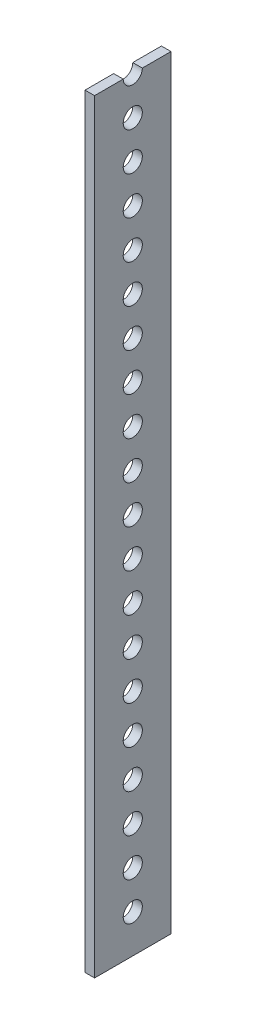
ISO-10303-21;
HEADER;
FILE_DESCRIPTION(('STEP AP214'),'2;1');
FILE_NAME('part.step','',(''),(''),'','','');
FILE_SCHEMA(('AUTOMOTIVE_DESIGN { 1 0 10303 214 1 1 1 1 }'));
ENDSEC;
DATA;
#1=APPLICATION_CONTEXT('core data for automotive mechanical design processes');
#2=APPLICATION_PROTOCOL_DEFINITION('international standard','automotive_design',2000,#1);
#3=PRODUCT_CONTEXT('',#1,'mechanical');
#4=PRODUCT('Part','Part','',(#3));
#5=PRODUCT_RELATED_PRODUCT_CATEGORY('part','',(#4));
#6=PRODUCT_DEFINITION_FORMATION('','',#4);
#7=PRODUCT_DEFINITION_CONTEXT('part definition',#1,'design');
#8=PRODUCT_DEFINITION('design','',#6,#7);
#9=PRODUCT_DEFINITION_SHAPE('','',#8);
#10=(LENGTH_UNIT() NAMED_UNIT(*) SI_UNIT(.MILLI.,.METRE.));
#11=(NAMED_UNIT(*) PLANE_ANGLE_UNIT() SI_UNIT($,.RADIAN.));
#12=(NAMED_UNIT(*) SI_UNIT($,.STERADIAN.) SOLID_ANGLE_UNIT());
#13=UNCERTAINTY_MEASURE_WITH_UNIT(LENGTH_MEASURE(1.E-05),#10,'distance_accuracy_value','');
#14=(GEOMETRIC_REPRESENTATION_CONTEXT(3) GLOBAL_UNCERTAINTY_ASSIGNED_CONTEXT((#13)) GLOBAL_UNIT_ASSIGNED_CONTEXT((#10,
#11,#12)) REPRESENTATION_CONTEXT('',''));
#15=CARTESIAN_POINT('',(0.,0.,0.));
#16=DIRECTION('',(0.,0.,1.));
#17=DIRECTION('',(1.,0.,0.));
#18=AXIS2_PLACEMENT_3D('',#15,#16,#17);
#19=CARTESIAN_POINT('',(3.175,0.,0.));
#20=DIRECTION('',(-1.,0.,0.));
#21=DIRECTION('',(0.,0.,1.));
#22=AXIS2_PLACEMENT_3D('',#19,#20,#21);
#23=PLANE('',#22);
#24=CARTESIAN_POINT('',(3.175,-685.8,0.));
#25=DIRECTION('',(1.,0.,0.));
#26=DIRECTION('',(0.,0.,-1.));
#27=AXIS2_PLACEMENT_3D('',#24,#25,#26);
#28=CIRCLE('',#27,3.175);
#29=CARTESIAN_POINT('',(3.175,-685.8,-3.175));
#30=VERTEX_POINT('',#29);
#31=EDGE_CURVE('E110',#30,#30,#28,.T.);
#32=ORIENTED_EDGE('',*,*,#31,.F.);
#33=EDGE_LOOP('',(#32));
#34=FACE_BOUND('',#33,.T.);
#35=CARTESIAN_POINT('',(3.175,-673.1,0.));
#36=DIRECTION('',(1.,0.,0.));
#37=DIRECTION('',(0.,0.,-1.));
#38=AXIS2_PLACEMENT_3D('',#35,#36,#37);
#39=CIRCLE('',#38,3.175);
#40=CARTESIAN_POINT('',(3.175,-673.1,-3.17499999999995));
#41=VERTEX_POINT('',#40);
#42=EDGE_CURVE('E239',#41,#41,#39,.T.);
#43=ORIENTED_EDGE('',*,*,#42,.F.);
#44=EDGE_LOOP('',(#43));
#45=FACE_BOUND('',#44,.T.);
#46=CARTESIAN_POINT('',(3.175,-660.4,0.));
#47=DIRECTION('',(1.,0.,0.));
#48=DIRECTION('',(0.,0.,-1.));
#49=AXIS2_PLACEMENT_3D('',#46,#47,#48);
#50=CIRCLE('',#49,3.175);
#51=CARTESIAN_POINT('',(3.175,-660.4,-3.17499999999991));
#52=VERTEX_POINT('',#51);
#53=EDGE_CURVE('E233',#52,#52,#50,.T.);
#54=ORIENTED_EDGE('',*,*,#53,.F.);
#55=EDGE_LOOP('',(#54));
#56=FACE_BOUND('',#55,.T.);
#57=CARTESIAN_POINT('',(3.175,-647.7,1.33025439009923E-13));
#58=DIRECTION('',(1.,0.,0.));
#59=DIRECTION('',(0.,0.,-1.));
#60=AXIS2_PLACEMENT_3D('',#57,#58,#59);
#61=CIRCLE('',#60,3.175);
#62=CARTESIAN_POINT('',(3.175,-647.7,-3.17499999999987));
#63=VERTEX_POINT('',#62);
#64=EDGE_CURVE('E227',#63,#63,#61,.T.);
#65=ORIENTED_EDGE('',*,*,#64,.F.);
#66=EDGE_LOOP('',(#65));
#67=FACE_BOUND('',#66,.T.);
#68=CARTESIAN_POINT('',(3.175,-635.,1.77367252013231E-13));
#69=DIRECTION('',(1.,0.,0.));
#70=DIRECTION('',(0.,0.,-1.));
#71=AXIS2_PLACEMENT_3D('',#68,#69,#70);
#72=CIRCLE('',#71,3.175);
#73=CARTESIAN_POINT('',(3.175,-635.,-3.17499999999982));
#74=VERTEX_POINT('',#73);
#75=EDGE_CURVE('E221',#74,#74,#72,.T.);
#76=ORIENTED_EDGE('',*,*,#75,.F.);
#77=EDGE_LOOP('',(#76));
#78=FACE_BOUND('',#77,.T.);
#79=CARTESIAN_POINT('',(3.175,-622.3,2.21709065016539E-13));
#80=DIRECTION('',(1.,0.,0.));
#81=DIRECTION('',(0.,0.,-1.));
#82=AXIS2_PLACEMENT_3D('',#79,#80,#81);
#83=CIRCLE('',#82,3.175);
#84=CARTESIAN_POINT('',(3.175,-622.3,-3.17499999999978));
#85=VERTEX_POINT('',#84);
#86=EDGE_CURVE('E215',#85,#85,#83,.T.);
#87=ORIENTED_EDGE('',*,*,#86,.F.);
#88=EDGE_LOOP('',(#87));
#89=FACE_BOUND('',#88,.T.);
#90=CARTESIAN_POINT('',(3.175,-609.6,2.66050878019847E-13));
#91=DIRECTION('',(1.,0.,0.));
#92=DIRECTION('',(0.,0.,-1.));
#93=AXIS2_PLACEMENT_3D('',#90,#91,#92);
#94=CIRCLE('',#93,3.17499999999997);
#95=CARTESIAN_POINT('',(3.175,-609.6,-3.1749999999997));
#96=VERTEX_POINT('',#95);
#97=EDGE_CURVE('E209',#96,#96,#94,.T.);
#98=ORIENTED_EDGE('',*,*,#97,.F.);
#99=EDGE_LOOP('',(#98));
#100=FACE_BOUND('',#99,.T.);
#101=CARTESIAN_POINT('',(3.175,-596.9,3.10392691023155E-13));
#102=DIRECTION('',(1.,0.,0.));
#103=DIRECTION('',(0.,0.,-1.));
#104=AXIS2_PLACEMENT_3D('',#101,#102,#103);
#105=CIRCLE('',#104,3.175);
#106=CARTESIAN_POINT('',(3.175,-596.9,-3.17499999999969));
#107=VERTEX_POINT('',#106);
#108=EDGE_CURVE('E203',#107,#107,#105,.T.);
#109=ORIENTED_EDGE('',*,*,#108,.F.);
#110=EDGE_LOOP('',(#109));
#111=FACE_BOUND('',#110,.T.);
#112=CARTESIAN_POINT('',(3.175,-584.2,3.54734504026462E-13));
#113=DIRECTION('',(1.,0.,0.));
#114=DIRECTION('',(0.,0.,-1.));
#115=AXIS2_PLACEMENT_3D('',#112,#113,#114);
#116=CIRCLE('',#115,3.175);
#117=CARTESIAN_POINT('',(3.175,-584.2,-3.17499999999964));
#118=VERTEX_POINT('',#117);
#119=EDGE_CURVE('E197',#118,#118,#116,.T.);
#120=ORIENTED_EDGE('',*,*,#119,.F.);
#121=EDGE_LOOP('',(#120));
#122=FACE_BOUND('',#121,.T.);
#123=CARTESIAN_POINT('',(3.175,-571.5,3.9907631702977E-13));
#124=DIRECTION('',(1.,0.,0.));
#125=DIRECTION('',(0.,0.,-1.));
#126=AXIS2_PLACEMENT_3D('',#123,#124,#125);
#127=CIRCLE('',#126,3.175);
#128=CARTESIAN_POINT('',(3.175,-571.5,-3.1749999999996));
#129=VERTEX_POINT('',#128);
#130=EDGE_CURVE('E191',#129,#129,#127,.T.);
#131=ORIENTED_EDGE('',*,*,#130,.F.);
#132=EDGE_LOOP('',(#131));
#133=FACE_BOUND('',#132,.T.);
#134=CARTESIAN_POINT('',(3.175,-558.8,4.43418130033078E-13));
#135=DIRECTION('',(1.,0.,0.));
#136=DIRECTION('',(0.,0.,-1.));
#137=AXIS2_PLACEMENT_3D('',#134,#135,#136);
#138=CIRCLE('',#137,3.175);
#139=CARTESIAN_POINT('',(3.175,-558.8,-3.17499999999956));
#140=VERTEX_POINT('',#139);
#141=EDGE_CURVE('E185',#140,#140,#138,.T.);
#142=ORIENTED_EDGE('',*,*,#141,.F.);
#143=EDGE_LOOP('',(#142));
#144=FACE_BOUND('',#143,.T.);
#145=CARTESIAN_POINT('',(3.175,-546.1,4.87759943036386E-13));
#146=DIRECTION('',(1.,0.,0.));
#147=DIRECTION('',(0.,0.,-1.));
#148=AXIS2_PLACEMENT_3D('',#145,#146,#147);
#149=CIRCLE('',#148,3.17500000000003);
#150=CARTESIAN_POINT('',(3.175,-546.1,-3.17499999999954));
#151=VERTEX_POINT('',#150);
#152=EDGE_CURVE('E179',#151,#151,#149,.T.);
#153=ORIENTED_EDGE('',*,*,#152,.F.);
#154=EDGE_LOOP('',(#153));
#155=FACE_BOUND('',#154,.T.);
#156=CARTESIAN_POINT('',(3.175,-533.4,5.32101756039693E-13));
#157=DIRECTION('',(1.,0.,0.));
#158=DIRECTION('',(0.,0.,-1.));
#159=AXIS2_PLACEMENT_3D('',#156,#157,#158);
#160=CIRCLE('',#159,3.175);
#161=CARTESIAN_POINT('',(3.175,-533.4,-3.17499999999947));
#162=VERTEX_POINT('',#161);
#163=EDGE_CURVE('E173',#162,#162,#160,.T.);
#164=ORIENTED_EDGE('',*,*,#163,.F.);
#165=EDGE_LOOP('',(#164));
#166=FACE_BOUND('',#165,.T.);
#167=CARTESIAN_POINT('',(3.175,-520.7,5.76443569043001E-13));
#168=DIRECTION('',(1.,0.,0.));
#169=DIRECTION('',(0.,0.,-1.));
#170=AXIS2_PLACEMENT_3D('',#167,#168,#169);
#171=CIRCLE('',#170,3.175);
#172=CARTESIAN_POINT('',(3.175,-520.7,-3.17499999999942));
#173=VERTEX_POINT('',#172);
#174=EDGE_CURVE('E167',#173,#173,#171,.T.);
#175=ORIENTED_EDGE('',*,*,#174,.F.);
#176=EDGE_LOOP('',(#175));
#177=FACE_BOUND('',#176,.T.);
#178=CARTESIAN_POINT('',(3.175,-508.,6.20785382046309E-13));
#179=DIRECTION('',(1.,0.,0.));
#180=DIRECTION('',(0.,0.,-1.));
#181=AXIS2_PLACEMENT_3D('',#178,#179,#180);
#182=CIRCLE('',#181,3.175);
#183=CARTESIAN_POINT('',(3.175,-508.,-3.17499999999938));
#184=VERTEX_POINT('',#183);
#185=EDGE_CURVE('E161',#184,#184,#182,.T.);
#186=ORIENTED_EDGE('',*,*,#185,.F.);
#187=EDGE_LOOP('',(#186));
#188=FACE_BOUND('',#187,.T.);
#189=CARTESIAN_POINT('',(3.175,-495.3,6.65127195049617E-13));
#190=DIRECTION('',(1.,0.,0.));
#191=DIRECTION('',(0.,0.,-1.));
#192=AXIS2_PLACEMENT_3D('',#189,#190,#191);
#193=CIRCLE('',#192,3.175);
#194=CARTESIAN_POINT('',(3.175,-495.3,-3.17499999999933));
#195=VERTEX_POINT('',#194);
#196=EDGE_CURVE('E155',#195,#195,#193,.T.);
#197=ORIENTED_EDGE('',*,*,#196,.F.);
#198=EDGE_LOOP('',(#197));
#199=FACE_BOUND('',#198,.T.);
#200=CARTESIAN_POINT('',(3.175,-482.6,7.09469008052925E-13));
#201=DIRECTION('',(1.,0.,0.));
#202=DIRECTION('',(0.,0.,-1.));
#203=AXIS2_PLACEMENT_3D('',#200,#201,#202);
#204=CIRCLE('',#203,3.175);
#205=CARTESIAN_POINT('',(3.175,-482.6,-3.17499999999929));
#206=VERTEX_POINT('',#205);
#207=EDGE_CURVE('E149',#206,#206,#204,.T.);
#208=ORIENTED_EDGE('',*,*,#207,.F.);
#209=EDGE_LOOP('',(#208));
#210=FACE_BOUND('',#209,.T.);
#211=CARTESIAN_POINT('',(3.175,-469.9,7.53810821056232E-13));
#212=DIRECTION('',(1.,0.,0.));
#213=DIRECTION('',(0.,0.,-1.));
#214=AXIS2_PLACEMENT_3D('',#211,#212,#213);
#215=CIRCLE('',#214,3.175);
#216=CARTESIAN_POINT('',(3.175,-469.9,-3.17499999999925));
#217=VERTEX_POINT('',#216);
#218=EDGE_CURVE('E143',#217,#217,#215,.T.);
#219=ORIENTED_EDGE('',*,*,#218,.F.);
#220=EDGE_LOOP('',(#219));
#221=FACE_BOUND('',#220,.T.);
#222=CARTESIAN_POINT('',(3.175,-457.2,7.9815263405954E-13));
#223=DIRECTION('',(1.,0.,0.));
#224=DIRECTION('',(0.,0.,-1.));
#225=AXIS2_PLACEMENT_3D('',#222,#223,#224);
#226=CIRCLE('',#225,3.175);
#227=CARTESIAN_POINT('',(3.175,-457.2,-3.1749999999992));
#228=VERTEX_POINT('',#227);
#229=EDGE_CURVE('E136',#228,#228,#226,.T.);
#230=ORIENTED_EDGE('',*,*,#229,.F.);
#231=EDGE_LOOP('',(#230));
#232=FACE_BOUND('',#231,.T.);
#233=DIRECTION('',(0.,1.,0.));
#234=VECTOR('',#233,1.);
#235=CARTESIAN_POINT('',(3.175,-698.500000000006,-12.7));
#236=LINE('',#235,#234);
#237=CARTESIAN_POINT('',(3.175,-698.500000000006,-12.7));
#238=VERTEX_POINT('',#237);
#239=CARTESIAN_POINT('',(3.175,-444.500000000006,-12.7));
#240=VERTEX_POINT('',#239);
#241=EDGE_CURVE('E107',#238,#240,#236,.T.);
#242=ORIENTED_EDGE('',*,*,#241,.T.);
#243=DIRECTION('',(0.,0.,1.));
#244=VECTOR('',#243,1.);
#245=CARTESIAN_POINT('',(3.175,-444.500000000006,0.));
#246=LINE('',#245,#244);
#247=CARTESIAN_POINT('',(3.175,-444.500000000006,-3.17499999999916));
#248=VERTEX_POINT('',#247);
#249=EDGE_CURVE('E121',#240,#248,#246,.T.);
#250=ORIENTED_EDGE('',*,*,#249,.T.);
#251=CARTESIAN_POINT('',(3.175,-444.5,8.42494447062848E-13));
#252=DIRECTION('',(1.,0.,0.));
#253=DIRECTION('',(0.,0.,-1.));
#254=AXIS2_PLACEMENT_3D('',#251,#252,#253);
#255=CIRCLE('',#254,3.175);
#256=CARTESIAN_POINT('',(3.175,-444.500000000006,3.17500000000084));
#257=VERTEX_POINT('',#256);
#258=EDGE_CURVE('E128',#257,#248,#255,.T.);
#259=ORIENTED_EDGE('',*,*,#258,.F.);
#260=CARTESIAN_POINT('',(3.175,-444.500000000006,12.6999999999999));
#261=VERTEX_POINT('',#260);
#262=EDGE_CURVE('E54',#257,#261,#246,.T.);
#263=ORIENTED_EDGE('',*,*,#262,.T.);
#264=DIRECTION('',(0.,-1.,0.));
#265=VECTOR('',#264,1.);
#266=CARTESIAN_POINT('',(3.175,-698.500000000006,12.7));
#267=LINE('',#266,#265);
#268=CARTESIAN_POINT('',(3.175,-698.500000000006,12.7));
#269=VERTEX_POINT('',#268);
#270=EDGE_CURVE('E97',#261,#269,#267,.T.);
#271=ORIENTED_EDGE('',*,*,#270,.T.);
#272=DIRECTION('',(0.,0.,-1.));
#273=VECTOR('',#272,1.);
#274=CARTESIAN_POINT('',(3.175,-698.500000000006,12.7));
#275=LINE('',#274,#273);
#276=EDGE_CURVE('E118',#269,#238,#275,.T.);
#277=ORIENTED_EDGE('',*,*,#276,.T.);
#278=EDGE_LOOP('',(#242,#250,#259,#263,#271,#277));
#279=FACE_BOUND('',#278,.T.);
#280=ADVANCED_FACE('F32',(#34,#45,#56,#67,#78,#89,#100,#111,#122,#133,#144,#155,#166,#177,#188,
#199,#210,#221,#232,#279),#23,.F.);
#281=CARTESIAN_POINT('',(0.,0.,0.));
#282=DIRECTION('',(-1.,0.,0.));
#283=DIRECTION('',(0.,0.,1.));
#284=AXIS2_PLACEMENT_3D('',#281,#282,#283);
#285=PLANE('',#284);
#286=DIRECTION('',(0.,0.,-1.));
#287=VECTOR('',#286,1.);
#288=CARTESIAN_POINT('',(0.,-444.500000000006,12.6999999999999));
#289=LINE('',#288,#287);
#290=CARTESIAN_POINT('',(0.,-444.500000000006,-3.17499999999916));
#291=VERTEX_POINT('',#290);
#292=CARTESIAN_POINT('',(0.,-444.500000000006,-12.7));
#293=VERTEX_POINT('',#292);
#294=EDGE_CURVE('E47',#291,#293,#289,.T.);
#295=ORIENTED_EDGE('',*,*,#294,.T.);
#296=DIRECTION('',(0.,1.,0.));
#297=VECTOR('',#296,1.);
#298=CARTESIAN_POINT('',(0.,-698.500000000006,-12.7));
#299=LINE('',#298,#297);
#300=CARTESIAN_POINT('',(0.,-698.500000000006,-12.7));
#301=VERTEX_POINT('',#300);
#302=EDGE_CURVE('E105',#301,#293,#299,.T.);
#303=ORIENTED_EDGE('',*,*,#302,.F.);
#304=DIRECTION('',(0.,0.,-1.));
#305=VECTOR('',#304,1.);
#306=CARTESIAN_POINT('',(0.,-698.500000000006,12.7));
#307=LINE('',#306,#305);
#308=CARTESIAN_POINT('',(0.,-698.500000000006,12.7));
#309=VERTEX_POINT('',#308);
#310=EDGE_CURVE('E104',#309,#301,#307,.T.);
#311=ORIENTED_EDGE('',*,*,#310,.F.);
#312=DIRECTION('',(0.,-1.,0.));
#313=VECTOR('',#312,1.);
#314=CARTESIAN_POINT('',(0.,-698.500000000006,12.7));
#315=LINE('',#314,#313);
#316=CARTESIAN_POINT('',(0.,-444.500000000006,12.6999999999999));
#317=VERTEX_POINT('',#316);
#318=EDGE_CURVE('E95',#317,#309,#315,.T.);
#319=ORIENTED_EDGE('',*,*,#318,.F.);
#320=CARTESIAN_POINT('',(0.,-444.500000000006,3.17500000000084));
#321=VERTEX_POINT('',#320);
#322=EDGE_CURVE('E82',#317,#321,#289,.T.);
#323=ORIENTED_EDGE('',*,*,#322,.T.);
#324=CARTESIAN_POINT('',(0.,-444.5,8.42494447062848E-13));
#325=DIRECTION('',(1.,0.,0.));
#326=DIRECTION('',(0.,0.,-1.));
#327=AXIS2_PLACEMENT_3D('',#324,#325,#326);
#328=CIRCLE('',#327,3.175);
#329=EDGE_CURVE('E133',#321,#291,#328,.T.);
#330=ORIENTED_EDGE('',*,*,#329,.T.);
#331=EDGE_LOOP('',(#295,#303,#311,#319,#323,#330));
#332=FACE_BOUND('',#331,.T.);
#333=CARTESIAN_POINT('',(0.,-469.9,7.53810821056232E-13));
#334=DIRECTION('',(1.,0.,0.));
#335=DIRECTION('',(0.,0.,-1.));
#336=AXIS2_PLACEMENT_3D('',#333,#334,#335);
#337=CIRCLE('',#336,3.175);
#338=CARTESIAN_POINT('',(0.,-469.9,-3.17499999999925));
#339=VERTEX_POINT('',#338);
#340=EDGE_CURVE('E141',#339,#339,#337,.T.);
#341=ORIENTED_EDGE('',*,*,#340,.T.);
#342=EDGE_LOOP('',(#341));
#343=FACE_BOUND('',#342,.T.);
#344=CARTESIAN_POINT('',(0.,-495.3,6.65127195049617E-13));
#345=DIRECTION('',(1.,0.,0.));
#346=DIRECTION('',(0.,0.,-1.));
#347=AXIS2_PLACEMENT_3D('',#344,#345,#346);
#348=CIRCLE('',#347,3.175);
#349=CARTESIAN_POINT('',(0.,-495.3,-3.17499999999933));
#350=VERTEX_POINT('',#349);
#351=EDGE_CURVE('E152',#350,#350,#348,.T.);
#352=ORIENTED_EDGE('',*,*,#351,.T.);
#353=EDGE_LOOP('',(#352));
#354=FACE_BOUND('',#353,.T.);
#355=CARTESIAN_POINT('',(0.,-520.7,5.76443569043001E-13));
#356=DIRECTION('',(1.,0.,0.));
#357=DIRECTION('',(0.,0.,-1.));
#358=AXIS2_PLACEMENT_3D('',#355,#356,#357);
#359=CIRCLE('',#358,3.175);
#360=CARTESIAN_POINT('',(0.,-520.7,-3.17499999999942));
#361=VERTEX_POINT('',#360);
#362=EDGE_CURVE('E164',#361,#361,#359,.T.);
#363=ORIENTED_EDGE('',*,*,#362,.T.);
#364=EDGE_LOOP('',(#363));
#365=FACE_BOUND('',#364,.T.);
#366=CARTESIAN_POINT('',(0.,-546.1,4.87759943036386E-13));
#367=DIRECTION('',(1.,0.,0.));
#368=DIRECTION('',(0.,0.,-1.));
#369=AXIS2_PLACEMENT_3D('',#366,#367,#368);
#370=CIRCLE('',#369,3.17500000000003);
#371=CARTESIAN_POINT('',(0.,-546.1,-3.17499999999954));
#372=VERTEX_POINT('',#371);
#373=EDGE_CURVE('E176',#372,#372,#370,.T.);
#374=ORIENTED_EDGE('',*,*,#373,.T.);
#375=EDGE_LOOP('',(#374));
#376=FACE_BOUND('',#375,.T.);
#377=CARTESIAN_POINT('',(0.,-571.5,3.9907631702977E-13));
#378=DIRECTION('',(1.,0.,0.));
#379=DIRECTION('',(0.,0.,-1.));
#380=AXIS2_PLACEMENT_3D('',#377,#378,#379);
#381=CIRCLE('',#380,3.175);
#382=CARTESIAN_POINT('',(0.,-571.5,-3.1749999999996));
#383=VERTEX_POINT('',#382);
#384=EDGE_CURVE('E188',#383,#383,#381,.T.);
#385=ORIENTED_EDGE('',*,*,#384,.T.);
#386=EDGE_LOOP('',(#385));
#387=FACE_BOUND('',#386,.T.);
#388=CARTESIAN_POINT('',(0.,-596.9,3.10392691023155E-13));
#389=DIRECTION('',(1.,0.,0.));
#390=DIRECTION('',(0.,0.,-1.));
#391=AXIS2_PLACEMENT_3D('',#388,#389,#390);
#392=CIRCLE('',#391,3.175);
#393=CARTESIAN_POINT('',(0.,-596.9,-3.17499999999969));
#394=VERTEX_POINT('',#393);
#395=EDGE_CURVE('E200',#394,#394,#392,.T.);
#396=ORIENTED_EDGE('',*,*,#395,.T.);
#397=EDGE_LOOP('',(#396));
#398=FACE_BOUND('',#397,.T.);
#399=CARTESIAN_POINT('',(0.,-622.3,2.21709065016539E-13));
#400=DIRECTION('',(1.,0.,0.));
#401=DIRECTION('',(0.,0.,-1.));
#402=AXIS2_PLACEMENT_3D('',#399,#400,#401);
#403=CIRCLE('',#402,3.175);
#404=CARTESIAN_POINT('',(0.,-622.3,-3.17499999999978));
#405=VERTEX_POINT('',#404);
#406=EDGE_CURVE('E212',#405,#405,#403,.T.);
#407=ORIENTED_EDGE('',*,*,#406,.T.);
#408=EDGE_LOOP('',(#407));
#409=FACE_BOUND('',#408,.T.);
#410=CARTESIAN_POINT('',(0.,-647.7,1.33025439009923E-13));
#411=DIRECTION('',(1.,0.,0.));
#412=DIRECTION('',(0.,0.,-1.));
#413=AXIS2_PLACEMENT_3D('',#410,#411,#412);
#414=CIRCLE('',#413,3.175);
#415=CARTESIAN_POINT('',(0.,-647.7,-3.17499999999987));
#416=VERTEX_POINT('',#415);
#417=EDGE_CURVE('E224',#416,#416,#414,.T.);
#418=ORIENTED_EDGE('',*,*,#417,.T.);
#419=EDGE_LOOP('',(#418));
#420=FACE_BOUND('',#419,.T.);
#421=CARTESIAN_POINT('',(0.,-673.1,0.));
#422=DIRECTION('',(1.,0.,0.));
#423=DIRECTION('',(0.,0.,-1.));
#424=AXIS2_PLACEMENT_3D('',#421,#422,#423);
#425=CIRCLE('',#424,3.175);
#426=CARTESIAN_POINT('',(0.,-673.1,-3.17499999999995));
#427=VERTEX_POINT('',#426);
#428=EDGE_CURVE('E236',#427,#427,#425,.T.);
#429=ORIENTED_EDGE('',*,*,#428,.T.);
#430=EDGE_LOOP('',(#429));
#431=FACE_BOUND('',#430,.T.);
#432=CARTESIAN_POINT('',(0.,-685.8,0.));
#433=DIRECTION('',(1.,0.,0.));
#434=DIRECTION('',(0.,0.,-1.));
#435=AXIS2_PLACEMENT_3D('',#432,#433,#434);
#436=CIRCLE('',#435,3.175);
#437=CARTESIAN_POINT('',(0.,-685.8,-3.175));
#438=VERTEX_POINT('',#437);
#439=EDGE_CURVE('E242',#438,#438,#436,.T.);
#440=ORIENTED_EDGE('',*,*,#439,.T.);
#441=EDGE_LOOP('',(#440));
#442=FACE_BOUND('',#441,.T.);
#443=CARTESIAN_POINT('',(0.,-660.4,0.));
#444=DIRECTION('',(1.,0.,0.));
#445=DIRECTION('',(0.,0.,-1.));
#446=AXIS2_PLACEMENT_3D('',#443,#444,#445);
#447=CIRCLE('',#446,3.175);
#448=CARTESIAN_POINT('',(0.,-660.4,-3.17499999999991));
#449=VERTEX_POINT('',#448);
#450=EDGE_CURVE('E230',#449,#449,#447,.T.);
#451=ORIENTED_EDGE('',*,*,#450,.T.);
#452=EDGE_LOOP('',(#451));
#453=FACE_BOUND('',#452,.T.);
#454=CARTESIAN_POINT('',(0.,-635.,1.77367252013231E-13));
#455=DIRECTION('',(1.,0.,0.));
#456=DIRECTION('',(0.,0.,-1.));
#457=AXIS2_PLACEMENT_3D('',#454,#455,#456);
#458=CIRCLE('',#457,3.175);
#459=CARTESIAN_POINT('',(0.,-635.,-3.17499999999982));
#460=VERTEX_POINT('',#459);
#461=EDGE_CURVE('E218',#460,#460,#458,.T.);
#462=ORIENTED_EDGE('',*,*,#461,.T.);
#463=EDGE_LOOP('',(#462));
#464=FACE_BOUND('',#463,.T.);
#465=CARTESIAN_POINT('',(0.,-609.6,2.66050878019847E-13));
#466=DIRECTION('',(1.,0.,0.));
#467=DIRECTION('',(0.,0.,-1.));
#468=AXIS2_PLACEMENT_3D('',#465,#466,#467);
#469=CIRCLE('',#468,3.17499999999997);
#470=CARTESIAN_POINT('',(0.,-609.6,-3.1749999999997));
#471=VERTEX_POINT('',#470);
#472=EDGE_CURVE('E206',#471,#471,#469,.T.);
#473=ORIENTED_EDGE('',*,*,#472,.T.);
#474=EDGE_LOOP('',(#473));
#475=FACE_BOUND('',#474,.T.);
#476=CARTESIAN_POINT('',(0.,-584.2,3.54734504026462E-13));
#477=DIRECTION('',(1.,0.,0.));
#478=DIRECTION('',(0.,0.,-1.));
#479=AXIS2_PLACEMENT_3D('',#476,#477,#478);
#480=CIRCLE('',#479,3.175);
#481=CARTESIAN_POINT('',(0.,-584.2,-3.17499999999964));
#482=VERTEX_POINT('',#481);
#483=EDGE_CURVE('E194',#482,#482,#480,.T.);
#484=ORIENTED_EDGE('',*,*,#483,.T.);
#485=EDGE_LOOP('',(#484));
#486=FACE_BOUND('',#485,.T.);
#487=CARTESIAN_POINT('',(0.,-558.8,4.43418130033078E-13));
#488=DIRECTION('',(1.,0.,0.));
#489=DIRECTION('',(0.,0.,-1.));
#490=AXIS2_PLACEMENT_3D('',#487,#488,#489);
#491=CIRCLE('',#490,3.175);
#492=CARTESIAN_POINT('',(0.,-558.8,-3.17499999999956));
#493=VERTEX_POINT('',#492);
#494=EDGE_CURVE('E182',#493,#493,#491,.T.);
#495=ORIENTED_EDGE('',*,*,#494,.T.);
#496=EDGE_LOOP('',(#495));
#497=FACE_BOUND('',#496,.T.);
#498=CARTESIAN_POINT('',(0.,-533.4,5.32101756039693E-13));
#499=DIRECTION('',(1.,0.,0.));
#500=DIRECTION('',(0.,0.,-1.));
#501=AXIS2_PLACEMENT_3D('',#498,#499,#500);
#502=CIRCLE('',#501,3.175);
#503=CARTESIAN_POINT('',(0.,-533.4,-3.17499999999947));
#504=VERTEX_POINT('',#503);
#505=EDGE_CURVE('E170',#504,#504,#502,.T.);
#506=ORIENTED_EDGE('',*,*,#505,.T.);
#507=EDGE_LOOP('',(#506));
#508=FACE_BOUND('',#507,.T.);
#509=CARTESIAN_POINT('',(0.,-508.,6.20785382046309E-13));
#510=DIRECTION('',(1.,0.,0.));
#511=DIRECTION('',(0.,0.,-1.));
#512=AXIS2_PLACEMENT_3D('',#509,#510,#511);
#513=CIRCLE('',#512,3.175);
#514=CARTESIAN_POINT('',(0.,-508.,-3.17499999999938));
#515=VERTEX_POINT('',#514);
#516=EDGE_CURVE('E158',#515,#515,#513,.T.);
#517=ORIENTED_EDGE('',*,*,#516,.T.);
#518=EDGE_LOOP('',(#517));
#519=FACE_BOUND('',#518,.T.);
#520=CARTESIAN_POINT('',(0.,-482.6,7.09469008052925E-13));
#521=DIRECTION('',(1.,0.,0.));
#522=DIRECTION('',(0.,0.,-1.));
#523=AXIS2_PLACEMENT_3D('',#520,#521,#522);
#524=CIRCLE('',#523,3.175);
#525=CARTESIAN_POINT('',(0.,-482.6,-3.17499999999929));
#526=VERTEX_POINT('',#525);
#527=EDGE_CURVE('E146',#526,#526,#524,.T.);
#528=ORIENTED_EDGE('',*,*,#527,.T.);
#529=EDGE_LOOP('',(#528));
#530=FACE_BOUND('',#529,.T.);
#531=CARTESIAN_POINT('',(0.,-457.2,7.9815263405954E-13));
#532=DIRECTION('',(1.,0.,0.));
#533=DIRECTION('',(0.,0.,-1.));
#534=AXIS2_PLACEMENT_3D('',#531,#532,#533);
#535=CIRCLE('',#534,3.175);
#536=CARTESIAN_POINT('',(0.,-457.2,-3.1749999999992));
#537=VERTEX_POINT('',#536);
#538=EDGE_CURVE('E132',#537,#537,#535,.T.);
#539=ORIENTED_EDGE('',*,*,#538,.T.);
#540=EDGE_LOOP('',(#539));
#541=FACE_BOUND('',#540,.T.);
#542=ADVANCED_FACE('F101',(#332,#343,#354,#365,#376,#387,#398,#409,#420,#431,#442,#453,#464,
#475,#486,#497,#508,#519,#530,#541),#285,.T.);
#543=CARTESIAN_POINT('',(3.175,-698.500000000006,-12.7));
#544=DIRECTION('',(0.,0.,1.));
#545=DIRECTION('',(1.,0.,0.));
#546=AXIS2_PLACEMENT_3D('',#543,#544,#545);
#547=PLANE('',#546);
#548=ORIENTED_EDGE('',*,*,#302,.T.);
#549=DIRECTION('',(1.,0.,0.));
#550=VECTOR('',#549,1.);
#551=CARTESIAN_POINT('',(0.,-444.500000000006,-12.7));
#552=LINE('',#551,#550);
#553=EDGE_CURVE('E98',#293,#240,#552,.T.);
#554=ORIENTED_EDGE('',*,*,#553,.T.);
#555=ORIENTED_EDGE('',*,*,#241,.F.);
#556=DIRECTION('',(-1.,0.,0.));
#557=VECTOR('',#556,1.);
#558=CARTESIAN_POINT('',(3.175,-698.500000000006,-12.7));
#559=LINE('',#558,#557);
#560=EDGE_CURVE('E114',#238,#301,#559,.T.);
#561=ORIENTED_EDGE('',*,*,#560,.T.);
#562=EDGE_LOOP('',(#548,#554,#555,#561));
#563=FACE_BOUND('',#562,.T.);
#564=ADVANCED_FACE('F34',(#563),#547,.F.);
#565=CARTESIAN_POINT('',(3.175,-698.500000000006,12.7));
#566=DIRECTION('',(0.,0.,-1.));
#567=DIRECTION('',(-1.,0.,0.));
#568=AXIS2_PLACEMENT_3D('',#565,#566,#567);
#569=PLANE('',#568);
#570=ORIENTED_EDGE('',*,*,#270,.F.);
#571=DIRECTION('',(1.,0.,0.));
#572=VECTOR('',#571,1.);
#573=CARTESIAN_POINT('',(0.,-444.500000000006,12.6999999999999));
#574=LINE('',#573,#572);
#575=EDGE_CURVE('E85',#317,#261,#574,.T.);
#576=ORIENTED_EDGE('',*,*,#575,.F.);
#577=ORIENTED_EDGE('',*,*,#318,.T.);
#578=DIRECTION('',(-1.,0.,0.));
#579=VECTOR('',#578,1.);
#580=CARTESIAN_POINT('',(3.175,-698.500000000006,12.7));
#581=LINE('',#580,#579);
#582=EDGE_CURVE('E117',#269,#309,#581,.T.);
#583=ORIENTED_EDGE('',*,*,#582,.F.);
#584=EDGE_LOOP('',(#570,#576,#577,#583));
#585=FACE_BOUND('',#584,.T.);
#586=ADVANCED_FACE('F93',(#585),#569,.F.);
#587=CARTESIAN_POINT('',(3.175,-698.500000000006,12.7));
#588=DIRECTION('',(0.,1.,0.));
#589=DIRECTION('',(0.,0.,1.));
#590=AXIS2_PLACEMENT_3D('',#587,#588,#589);
#591=PLANE('',#590);
#592=ORIENTED_EDGE('',*,*,#310,.T.);
#593=ORIENTED_EDGE('',*,*,#560,.F.);
#594=ORIENTED_EDGE('',*,*,#276,.F.);
#595=ORIENTED_EDGE('',*,*,#582,.T.);
#596=EDGE_LOOP('',(#592,#593,#594,#595));
#597=FACE_BOUND('',#596,.T.);
#598=ADVANCED_FACE('F253',(#597),#591,.F.);
#599=CARTESIAN_POINT('',(3.175,-685.8,0.));
#600=DIRECTION('',(-1.,0.,0.));
#601=DIRECTION('',(0.,0.,1.));
#602=AXIS2_PLACEMENT_3D('',#599,#600,#601);
#603=CYLINDRICAL_SURFACE('',#602,3.175);
#604=ORIENTED_EDGE('',*,*,#31,.T.);
#605=EDGE_LOOP('',(#604));
#606=FACE_BOUND('',#605,.T.);
#607=ORIENTED_EDGE('',*,*,#439,.F.);
#608=EDGE_LOOP('',(#607));
#609=FACE_BOUND('',#608,.T.);
#610=ADVANCED_FACE('F271',(#606,#609),#603,.F.);
#611=CARTESIAN_POINT('',(3.175,-673.1,0.));
#612=DIRECTION('',(-1.,0.,0.));
#613=DIRECTION('',(0.,0.,1.));
#614=AXIS2_PLACEMENT_3D('',#611,#612,#613);
#615=CYLINDRICAL_SURFACE('',#614,3.175);
#616=ORIENTED_EDGE('',*,*,#42,.T.);
#617=EDGE_LOOP('',(#616));
#618=FACE_BOUND('',#617,.T.);
#619=ORIENTED_EDGE('',*,*,#428,.F.);
#620=EDGE_LOOP('',(#619));
#621=FACE_BOUND('',#620,.T.);
#622=ADVANCED_FACE('F279',(#618,#621),#615,.F.);
#623=CARTESIAN_POINT('',(3.175,-660.4,0.));
#624=DIRECTION('',(-1.,0.,0.));
#625=DIRECTION('',(0.,0.,1.));
#626=AXIS2_PLACEMENT_3D('',#623,#624,#625);
#627=CYLINDRICAL_SURFACE('',#626,3.175);
#628=ORIENTED_EDGE('',*,*,#53,.T.);
#629=EDGE_LOOP('',(#628));
#630=FACE_BOUND('',#629,.T.);
#631=ORIENTED_EDGE('',*,*,#450,.F.);
#632=EDGE_LOOP('',(#631));
#633=FACE_BOUND('',#632,.T.);
#634=ADVANCED_FACE('F284',(#630,#633),#627,.F.);
#635=CARTESIAN_POINT('',(3.175,-647.7,1.33025439009923E-13));
#636=DIRECTION('',(-1.,0.,0.));
#637=DIRECTION('',(0.,0.,1.));
#638=AXIS2_PLACEMENT_3D('',#635,#636,#637);
#639=CYLINDRICAL_SURFACE('',#638,3.175);
#640=ORIENTED_EDGE('',*,*,#64,.T.);
#641=EDGE_LOOP('',(#640));
#642=FACE_BOUND('',#641,.T.);
#643=ORIENTED_EDGE('',*,*,#417,.F.);
#644=EDGE_LOOP('',(#643));
#645=FACE_BOUND('',#644,.T.);
#646=ADVANCED_FACE('F373',(#642,#645),#639,.F.);
#647=CARTESIAN_POINT('',(3.175,-635.,1.77367252013231E-13));
#648=DIRECTION('',(-1.,0.,0.));
#649=DIRECTION('',(0.,0.,1.));
#650=AXIS2_PLACEMENT_3D('',#647,#648,#649);
#651=CYLINDRICAL_SURFACE('',#650,3.175);
#652=ORIENTED_EDGE('',*,*,#75,.T.);
#653=EDGE_LOOP('',(#652));
#654=FACE_BOUND('',#653,.T.);
#655=ORIENTED_EDGE('',*,*,#461,.F.);
#656=EDGE_LOOP('',(#655));
#657=FACE_BOUND('',#656,.T.);
#658=ADVANCED_FACE('F369',(#654,#657),#651,.F.);
#659=CARTESIAN_POINT('',(3.175,-622.3,2.21709065016539E-13));
#660=DIRECTION('',(-1.,0.,0.));
#661=DIRECTION('',(0.,0.,1.));
#662=AXIS2_PLACEMENT_3D('',#659,#660,#661);
#663=CYLINDRICAL_SURFACE('',#662,3.175);
#664=ORIENTED_EDGE('',*,*,#86,.T.);
#665=EDGE_LOOP('',(#664));
#666=FACE_BOUND('',#665,.T.);
#667=ORIENTED_EDGE('',*,*,#406,.F.);
#668=EDGE_LOOP('',(#667));
#669=FACE_BOUND('',#668,.T.);
#670=ADVANCED_FACE('F365',(#666,#669),#663,.F.);
#671=CARTESIAN_POINT('',(3.175,-609.6,2.66050878019847E-13));
#672=DIRECTION('',(-1.,0.,0.));
#673=DIRECTION('',(0.,0.,1.));
#674=AXIS2_PLACEMENT_3D('',#671,#672,#673);
#675=CYLINDRICAL_SURFACE('',#674,3.17499999999997);
#676=ORIENTED_EDGE('',*,*,#97,.T.);
#677=EDGE_LOOP('',(#676));
#678=FACE_BOUND('',#677,.T.);
#679=ORIENTED_EDGE('',*,*,#472,.F.);
#680=EDGE_LOOP('',(#679));
#681=FACE_BOUND('',#680,.T.);
#682=ADVANCED_FACE('F361',(#678,#681),#675,.F.);
#683=CARTESIAN_POINT('',(3.175,-596.9,3.10392691023155E-13));
#684=DIRECTION('',(-1.,0.,0.));
#685=DIRECTION('',(0.,0.,1.));
#686=AXIS2_PLACEMENT_3D('',#683,#684,#685);
#687=CYLINDRICAL_SURFACE('',#686,3.175);
#688=ORIENTED_EDGE('',*,*,#108,.T.);
#689=EDGE_LOOP('',(#688));
#690=FACE_BOUND('',#689,.T.);
#691=ORIENTED_EDGE('',*,*,#395,.F.);
#692=EDGE_LOOP('',(#691));
#693=FACE_BOUND('',#692,.T.);
#694=ADVANCED_FACE('F357',(#690,#693),#687,.F.);
#695=CARTESIAN_POINT('',(3.175,-584.2,3.54734504026462E-13));
#696=DIRECTION('',(-1.,0.,0.));
#697=DIRECTION('',(0.,0.,1.));
#698=AXIS2_PLACEMENT_3D('',#695,#696,#697);
#699=CYLINDRICAL_SURFACE('',#698,3.175);
#700=ORIENTED_EDGE('',*,*,#119,.T.);
#701=EDGE_LOOP('',(#700));
#702=FACE_BOUND('',#701,.T.);
#703=ORIENTED_EDGE('',*,*,#483,.F.);
#704=EDGE_LOOP('',(#703));
#705=FACE_BOUND('',#704,.T.);
#706=ADVANCED_FACE('F353',(#702,#705),#699,.F.);
#707=CARTESIAN_POINT('',(3.175,-571.5,3.9907631702977E-13));
#708=DIRECTION('',(-1.,0.,0.));
#709=DIRECTION('',(0.,0.,1.));
#710=AXIS2_PLACEMENT_3D('',#707,#708,#709);
#711=CYLINDRICAL_SURFACE('',#710,3.175);
#712=ORIENTED_EDGE('',*,*,#130,.T.);
#713=EDGE_LOOP('',(#712));
#714=FACE_BOUND('',#713,.T.);
#715=ORIENTED_EDGE('',*,*,#384,.F.);
#716=EDGE_LOOP('',(#715));
#717=FACE_BOUND('',#716,.T.);
#718=ADVANCED_FACE('F349',(#714,#717),#711,.F.);
#719=CARTESIAN_POINT('',(3.175,-558.8,4.43418130033078E-13));
#720=DIRECTION('',(-1.,0.,0.));
#721=DIRECTION('',(0.,0.,1.));
#722=AXIS2_PLACEMENT_3D('',#719,#720,#721);
#723=CYLINDRICAL_SURFACE('',#722,3.175);
#724=ORIENTED_EDGE('',*,*,#141,.T.);
#725=EDGE_LOOP('',(#724));
#726=FACE_BOUND('',#725,.T.);
#727=ORIENTED_EDGE('',*,*,#494,.F.);
#728=EDGE_LOOP('',(#727));
#729=FACE_BOUND('',#728,.T.);
#730=ADVANCED_FACE('F345',(#726,#729),#723,.F.);
#731=CARTESIAN_POINT('',(3.175,-546.1,4.87759943036386E-13));
#732=DIRECTION('',(-1.,0.,0.));
#733=DIRECTION('',(0.,0.,1.));
#734=AXIS2_PLACEMENT_3D('',#731,#732,#733);
#735=CYLINDRICAL_SURFACE('',#734,3.17500000000003);
#736=ORIENTED_EDGE('',*,*,#152,.T.);
#737=EDGE_LOOP('',(#736));
#738=FACE_BOUND('',#737,.T.);
#739=ORIENTED_EDGE('',*,*,#373,.F.);
#740=EDGE_LOOP('',(#739));
#741=FACE_BOUND('',#740,.T.);
#742=ADVANCED_FACE('F341',(#738,#741),#735,.F.);
#743=CARTESIAN_POINT('',(3.175,-533.4,5.32101756039693E-13));
#744=DIRECTION('',(-1.,0.,0.));
#745=DIRECTION('',(0.,0.,1.));
#746=AXIS2_PLACEMENT_3D('',#743,#744,#745);
#747=CYLINDRICAL_SURFACE('',#746,3.175);
#748=ORIENTED_EDGE('',*,*,#163,.T.);
#749=EDGE_LOOP('',(#748));
#750=FACE_BOUND('',#749,.T.);
#751=ORIENTED_EDGE('',*,*,#505,.F.);
#752=EDGE_LOOP('',(#751));
#753=FACE_BOUND('',#752,.T.);
#754=ADVANCED_FACE('F337',(#750,#753),#747,.F.);
#755=CARTESIAN_POINT('',(3.175,-520.7,5.76443569043001E-13));
#756=DIRECTION('',(-1.,0.,0.));
#757=DIRECTION('',(0.,0.,1.));
#758=AXIS2_PLACEMENT_3D('',#755,#756,#757);
#759=CYLINDRICAL_SURFACE('',#758,3.175);
#760=ORIENTED_EDGE('',*,*,#174,.T.);
#761=EDGE_LOOP('',(#760));
#762=FACE_BOUND('',#761,.T.);
#763=ORIENTED_EDGE('',*,*,#362,.F.);
#764=EDGE_LOOP('',(#763));
#765=FACE_BOUND('',#764,.T.);
#766=ADVANCED_FACE('F333',(#762,#765),#759,.F.);
#767=CARTESIAN_POINT('',(3.175,-508.,6.20785382046309E-13));
#768=DIRECTION('',(-1.,0.,0.));
#769=DIRECTION('',(0.,0.,1.));
#770=AXIS2_PLACEMENT_3D('',#767,#768,#769);
#771=CYLINDRICAL_SURFACE('',#770,3.175);
#772=ORIENTED_EDGE('',*,*,#185,.T.);
#773=EDGE_LOOP('',(#772));
#774=FACE_BOUND('',#773,.T.);
#775=ORIENTED_EDGE('',*,*,#516,.F.);
#776=EDGE_LOOP('',(#775));
#777=FACE_BOUND('',#776,.T.);
#778=ADVANCED_FACE('F329',(#774,#777),#771,.F.);
#779=CARTESIAN_POINT('',(3.175,-495.3,6.65127195049617E-13));
#780=DIRECTION('',(-1.,0.,0.));
#781=DIRECTION('',(0.,0.,1.));
#782=AXIS2_PLACEMENT_3D('',#779,#780,#781);
#783=CYLINDRICAL_SURFACE('',#782,3.175);
#784=ORIENTED_EDGE('',*,*,#196,.T.);
#785=EDGE_LOOP('',(#784));
#786=FACE_BOUND('',#785,.T.);
#787=ORIENTED_EDGE('',*,*,#351,.F.);
#788=EDGE_LOOP('',(#787));
#789=FACE_BOUND('',#788,.T.);
#790=ADVANCED_FACE('F325',(#786,#789),#783,.F.);
#791=CARTESIAN_POINT('',(3.175,-482.6,7.09469008052925E-13));
#792=DIRECTION('',(-1.,0.,0.));
#793=DIRECTION('',(0.,0.,1.));
#794=AXIS2_PLACEMENT_3D('',#791,#792,#793);
#795=CYLINDRICAL_SURFACE('',#794,3.175);
#796=ORIENTED_EDGE('',*,*,#207,.T.);
#797=EDGE_LOOP('',(#796));
#798=FACE_BOUND('',#797,.T.);
#799=ORIENTED_EDGE('',*,*,#527,.F.);
#800=EDGE_LOOP('',(#799));
#801=FACE_BOUND('',#800,.T.);
#802=ADVANCED_FACE('F318',(#798,#801),#795,.F.);
#803=CARTESIAN_POINT('',(3.175,-469.9,7.53810821056232E-13));
#804=DIRECTION('',(-1.,0.,0.));
#805=DIRECTION('',(0.,0.,1.));
#806=AXIS2_PLACEMENT_3D('',#803,#804,#805);
#807=CYLINDRICAL_SURFACE('',#806,3.175);
#808=ORIENTED_EDGE('',*,*,#218,.T.);
#809=EDGE_LOOP('',(#808));
#810=FACE_BOUND('',#809,.T.);
#811=ORIENTED_EDGE('',*,*,#340,.F.);
#812=EDGE_LOOP('',(#811));
#813=FACE_BOUND('',#812,.T.);
#814=ADVANCED_FACE('F310',(#810,#813),#807,.F.);
#815=CARTESIAN_POINT('',(3.175,-457.2,7.9815263405954E-13));
#816=DIRECTION('',(-1.,0.,0.));
#817=DIRECTION('',(0.,0.,1.));
#818=AXIS2_PLACEMENT_3D('',#815,#816,#817);
#819=CYLINDRICAL_SURFACE('',#818,3.175);
#820=ORIENTED_EDGE('',*,*,#229,.T.);
#821=EDGE_LOOP('',(#820));
#822=FACE_BOUND('',#821,.T.);
#823=ORIENTED_EDGE('',*,*,#538,.F.);
#824=EDGE_LOOP('',(#823));
#825=FACE_BOUND('',#824,.T.);
#826=ADVANCED_FACE('F308',(#822,#825),#819,.F.);
#827=CARTESIAN_POINT('',(3.175,-444.5,8.42494447062848E-13));
#828=DIRECTION('',(-1.,0.,0.));
#829=DIRECTION('',(0.,0.,1.));
#830=AXIS2_PLACEMENT_3D('',#827,#828,#829);
#831=CYLINDRICAL_SURFACE('',#830,3.175);
#832=DIRECTION('',(-1.,0.,0.));
#833=VECTOR('',#832,1.);
#834=CARTESIAN_POINT('',(3.175,-444.500000000006,3.17500000000084));
#835=LINE('',#834,#833);
#836=EDGE_CURVE('E11',#257,#321,#835,.T.);
#837=ORIENTED_EDGE('',*,*,#836,.F.);
#838=ORIENTED_EDGE('',*,*,#258,.T.);
#839=DIRECTION('',(-1.,0.,0.));
#840=VECTOR('',#839,1.);
#841=CARTESIAN_POINT('',(3.175,-444.500000000006,-3.17499999999916));
#842=LINE('',#841,#840);
#843=EDGE_CURVE('E40',#291,#248,#842,.F.);
#844=ORIENTED_EDGE('',*,*,#843,.F.);
#845=ORIENTED_EDGE('',*,*,#329,.F.);
#846=EDGE_LOOP('',(#837,#838,#844,#845));
#847=FACE_BOUND('',#846,.T.);
#848=ADVANCED_FACE('F131',(#847),#831,.F.);
#849=CARTESIAN_POINT('',(0.,-444.500000000006,12.6999999999999));
#850=DIRECTION('',(0.,-1.,0.));
#851=DIRECTION('',(0.,0.,-1.));
#852=AXIS2_PLACEMENT_3D('',#849,#850,#851);
#853=PLANE('',#852);
#854=ORIENTED_EDGE('',*,*,#553,.F.);
#855=ORIENTED_EDGE('',*,*,#294,.F.);
#856=ORIENTED_EDGE('',*,*,#843,.T.);
#857=ORIENTED_EDGE('',*,*,#249,.F.);
#858=EDGE_LOOP('',(#854,#855,#856,#857));
#859=FACE_BOUND('',#858,.T.);
#860=ADVANCED_FACE('F120',(#859),#853,.F.);
#861=ORIENTED_EDGE('',*,*,#836,.T.);
#862=ORIENTED_EDGE('',*,*,#322,.F.);
#863=ORIENTED_EDGE('',*,*,#575,.T.);
#864=ORIENTED_EDGE('',*,*,#262,.F.);
#865=EDGE_LOOP('',(#861,#862,#863,#864));
#866=FACE_BOUND('',#865,.T.);
#867=ADVANCED_FACE('F84',(#866),#853,.F.);
#868=CLOSED_SHELL('',(#280,#542,#564,#586,#598,#610,#622,#634,#646,#658,#670,#682,#694,#706,
#718,#730,#742,#754,#766,#778,#790,#802,#814,#826,#848,#860,#867));
#869=MANIFOLD_SOLID_BREP('B2',#868);
#870=ADVANCED_BREP_SHAPE_REPRESENTATION('',(#18,#869),#14);
#871=SHAPE_DEFINITION_REPRESENTATION(#9,#870);
ENDSEC;
END-ISO-10303-21;
